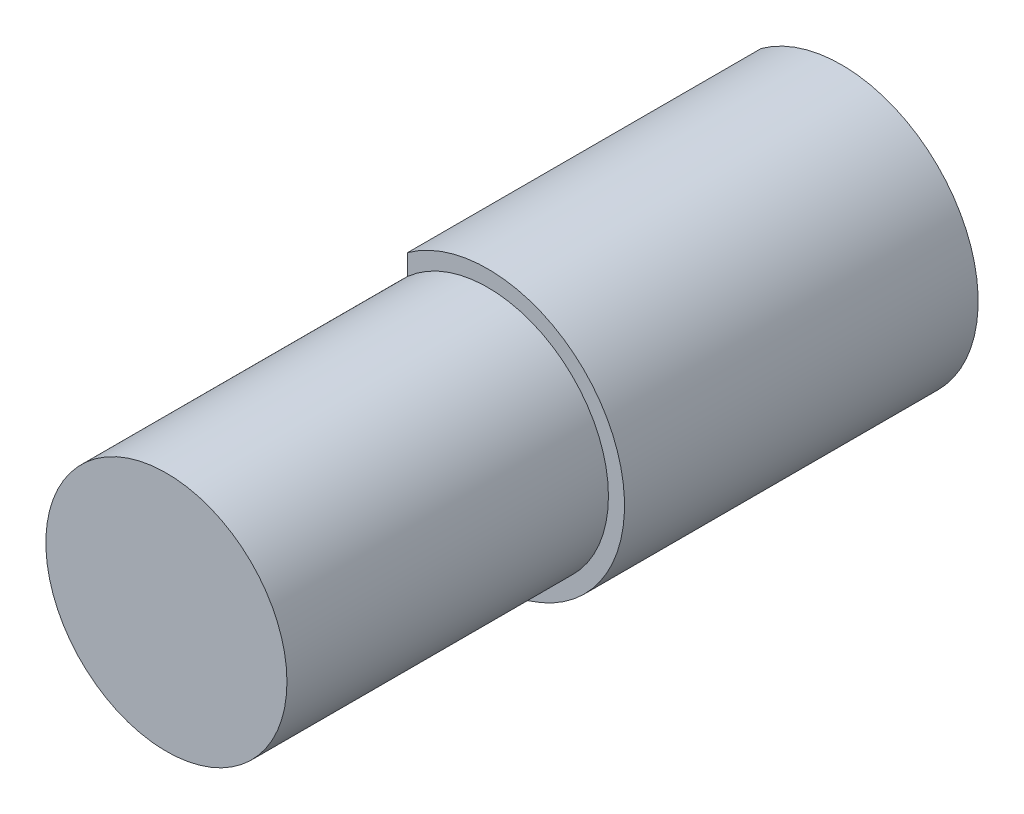
ISO-10303-21;
HEADER;
FILE_DESCRIPTION(('STEP AP214'),'2;1');
FILE_NAME('part.step','',(''),(''),'','','');
FILE_SCHEMA(('AUTOMOTIVE_DESIGN { 1 0 10303 214 1 1 1 1 }'));
ENDSEC;
DATA;
#1=APPLICATION_CONTEXT('core data for automotive mechanical design processes');
#2=APPLICATION_PROTOCOL_DEFINITION('international standard','automotive_design',2000,#1);
#3=PRODUCT_CONTEXT('',#1,'mechanical');
#4=PRODUCT('Part','Part','',(#3));
#5=PRODUCT_RELATED_PRODUCT_CATEGORY('part','',(#4));
#6=PRODUCT_DEFINITION_FORMATION('','',#4);
#7=PRODUCT_DEFINITION_CONTEXT('part definition',#1,'design');
#8=PRODUCT_DEFINITION('design','',#6,#7);
#9=PRODUCT_DEFINITION_SHAPE('','',#8);
#10=(LENGTH_UNIT() NAMED_UNIT(*) SI_UNIT(.MILLI.,.METRE.));
#11=(NAMED_UNIT(*) PLANE_ANGLE_UNIT() SI_UNIT($,.RADIAN.));
#12=(NAMED_UNIT(*) SI_UNIT($,.STERADIAN.) SOLID_ANGLE_UNIT());
#13=UNCERTAINTY_MEASURE_WITH_UNIT(LENGTH_MEASURE(1.E-05),#10,'distance_accuracy_value','');
#14=(GEOMETRIC_REPRESENTATION_CONTEXT(3) GLOBAL_UNCERTAINTY_ASSIGNED_CONTEXT((#13)) GLOBAL_UNIT_ASSIGNED_CONTEXT((#10,
#11,#12)) REPRESENTATION_CONTEXT('',''));
#15=CARTESIAN_POINT('',(0.,0.,0.));
#16=DIRECTION('',(0.,0.,1.));
#17=DIRECTION('',(1.,0.,0.));
#18=AXIS2_PLACEMENT_3D('',#15,#16,#17);
#19=CARTESIAN_POINT('',(0.,0.,-2.02081528017131));
#20=DIRECTION('',(0.,0.,1.));
#21=DIRECTION('',(1.,0.,0.));
#22=AXIS2_PLACEMENT_3D('',#19,#20,#21);
#23=CYLINDRICAL_SURFACE('',#22,3.75);
#24=CARTESIAN_POINT('',(0.,0.,10.));
#25=DIRECTION('',(0.,0.,1.));
#26=DIRECTION('',(1.,0.,0.));
#27=AXIS2_PLACEMENT_3D('',#24,#25,#26);
#28=CIRCLE('',#27,3.75);
#29=CARTESIAN_POINT('',(-2.5,-2.79508497187474,10.));
#30=VERTEX_POINT('',#29);
#31=CARTESIAN_POINT('',(-2.5,2.79508497187473,10.));
#32=VERTEX_POINT('',#31);
#33=EDGE_CURVE('E74',#30,#32,#28,.F.);
#34=ORIENTED_EDGE('',*,*,#33,.F.);
#35=EDGE_CURVE('E50',#32,#30,#28,.F.);
#36=ORIENTED_EDGE('',*,*,#35,.F.);
#37=EDGE_LOOP('',(#34,#36));
#38=FACE_BOUND('',#37,.T.);
#39=CARTESIAN_POINT('',(0.,0.,20.));
#40=DIRECTION('',(0.,0.,1.));
#41=DIRECTION('',(1.,0.,0.));
#42=AXIS2_PLACEMENT_3D('',#39,#40,#41);
#43=CIRCLE('',#42,3.75);
#44=CARTESIAN_POINT('',(3.75,0.,20.));
#45=VERTEX_POINT('',#44);
#46=EDGE_CURVE('E105',#45,#45,#43,.T.);
#47=ORIENTED_EDGE('',*,*,#46,.F.);
#48=EDGE_LOOP('',(#47));
#49=FACE_BOUND('',#48,.T.);
#50=ADVANCED_FACE('F33',(#38,#49),#23,.T.);
#51=CARTESIAN_POINT('',(0.,0.,10.));
#52=DIRECTION('',(0.,0.,-1.));
#53=DIRECTION('',(-1.,0.,0.));
#54=AXIS2_PLACEMENT_3D('',#51,#52,#53);
#55=CYLINDRICAL_SURFACE('',#54,4.25);
#56=CARTESIAN_POINT('',(0.,0.,10.));
#57=DIRECTION('',(0.,0.,1.));
#58=DIRECTION('',(1.,0.,0.));
#59=AXIS2_PLACEMENT_3D('',#56,#57,#58);
#60=CIRCLE('',#59,4.25);
#61=CARTESIAN_POINT('',(-2.5,3.43693177121688,10.));
#62=VERTEX_POINT('',#61);
#63=CARTESIAN_POINT('',(-2.5,-3.43693177121688,10.));
#64=VERTEX_POINT('',#63);
#65=EDGE_CURVE('E75',#62,#64,#60,.F.);
#66=ORIENTED_EDGE('',*,*,#65,.T.);
#67=DIRECTION('',(0.,0.,-1.));
#68=VECTOR('',#67,1.);
#69=CARTESIAN_POINT('',(-2.5,-3.43693177121688,10.));
#70=LINE('',#69,#68);
#71=CARTESIAN_POINT('',(-2.5,-3.43693177121688,-1.));
#72=VERTEX_POINT('',#71);
#73=EDGE_CURVE('E43',#64,#72,#70,.T.);
#74=ORIENTED_EDGE('',*,*,#73,.T.);
#75=CARTESIAN_POINT('',(0.,0.,-1.));
#76=DIRECTION('',(0.,0.,-1.));
#77=DIRECTION('',(-1.,0.,0.));
#78=AXIS2_PLACEMENT_3D('',#75,#76,#77);
#79=CIRCLE('',#78,4.25);
#80=CARTESIAN_POINT('',(-2.5,3.43693177121688,-1.));
#81=VERTEX_POINT('',#80);
#82=EDGE_CURVE('E81',#81,#72,#79,.T.);
#83=ORIENTED_EDGE('',*,*,#82,.F.);
#84=DIRECTION('',(0.,0.,-1.));
#85=VECTOR('',#84,1.);
#86=CARTESIAN_POINT('',(-2.5,3.43693177121688,10.));
#87=LINE('',#86,#85);
#88=EDGE_CURVE('E11',#62,#81,#87,.T.);
#89=ORIENTED_EDGE('',*,*,#88,.F.);
#90=EDGE_LOOP('',(#66,#74,#83,#89));
#91=FACE_BOUND('',#90,.T.);
#92=ADVANCED_FACE('F35',(#91),#55,.T.);
#93=CARTESIAN_POINT('',(0.,0.,10.));
#94=DIRECTION('',(0.,0.,1.));
#95=DIRECTION('',(1.,0.,0.));
#96=AXIS2_PLACEMENT_3D('',#93,#94,#95);
#97=PLANE('',#96);
#98=ORIENTED_EDGE('',*,*,#33,.T.);
#99=DIRECTION('',(0.,-1.,0.));
#100=VECTOR('',#99,1.);
#101=CARTESIAN_POINT('',(-2.5,3.43693177121688,10.));
#102=LINE('',#101,#100);
#103=EDGE_CURVE('E84',#32,#30,#102,.T.);
#104=ORIENTED_EDGE('',*,*,#103,.T.);
#105=EDGE_LOOP('',(#98,#104));
#106=FACE_BOUND('',#105,.T.);
#107=ADVANCED_FACE('F86',(#106),#97,.F.);
#108=CARTESIAN_POINT('',(-2.5,3.43693177121688,10.));
#109=DIRECTION('',(1.,0.,0.));
#110=DIRECTION('',(0.,0.,-1.));
#111=AXIS2_PLACEMENT_3D('',#108,#109,#110);
#112=PLANE('',#111);
#113=ORIENTED_EDGE('',*,*,#88,.T.);
#114=DIRECTION('',(0.,1.,0.));
#115=VECTOR('',#114,1.);
#116=CARTESIAN_POINT('',(-2.5,-3.43693177121688,-1.));
#117=LINE('',#116,#115);
#118=EDGE_CURVE('E85',#72,#81,#117,.T.);
#119=ORIENTED_EDGE('',*,*,#118,.F.);
#120=ORIENTED_EDGE('',*,*,#73,.F.);
#121=EDGE_CURVE('E37',#30,#64,#102,.T.);
#122=ORIENTED_EDGE('',*,*,#121,.F.);
#123=ORIENTED_EDGE('',*,*,#103,.F.);
#124=EDGE_CURVE('E72',#62,#32,#102,.T.);
#125=ORIENTED_EDGE('',*,*,#124,.F.);
#126=EDGE_LOOP('',(#113,#119,#120,#122,#123,#125));
#127=FACE_BOUND('',#126,.T.);
#128=ADVANCED_FACE('F83',(#127),#112,.F.);
#129=CARTESIAN_POINT('',(0.,0.,-1.));
#130=DIRECTION('',(0.,0.,-1.));
#131=DIRECTION('',(-1.,0.,0.));
#132=AXIS2_PLACEMENT_3D('',#129,#130,#131);
#133=PLANE('',#132);
#134=ORIENTED_EDGE('',*,*,#82,.T.);
#135=ORIENTED_EDGE('',*,*,#118,.T.);
#136=EDGE_LOOP('',(#134,#135));
#137=FACE_BOUND('',#136,.T.);
#138=ADVANCED_FACE('F102',(#137),#133,.T.);
#139=CARTESIAN_POINT('',(0.,0.,10.));
#140=DIRECTION('',(0.,0.,1.));
#141=DIRECTION('',(1.,0.,0.));
#142=AXIS2_PLACEMENT_3D('',#139,#140,#141);
#143=PLANE('',#142);
#144=ORIENTED_EDGE('',*,*,#124,.T.);
#145=ORIENTED_EDGE('',*,*,#35,.T.);
#146=ORIENTED_EDGE('',*,*,#121,.T.);
#147=ORIENTED_EDGE('',*,*,#65,.F.);
#148=EDGE_LOOP('',(#144,#145,#146,#147));
#149=FACE_BOUND('',#148,.T.);
#150=ADVANCED_FACE('F69',(#149),#143,.T.);
#151=CARTESIAN_POINT('',(0.,0.,20.));
#152=DIRECTION('',(0.,0.,1.));
#153=DIRECTION('',(1.,0.,0.));
#154=AXIS2_PLACEMENT_3D('',#151,#152,#153);
#155=PLANE('',#154);
#156=ORIENTED_EDGE('',*,*,#46,.T.);
#157=EDGE_LOOP('',(#156));
#158=FACE_BOUND('',#157,.T.);
#159=ADVANCED_FACE('F111',(#158),#155,.T.);
#160=CLOSED_SHELL('',(#50,#92,#107,#128,#138,#150,#159));
#161=MANIFOLD_SOLID_BREP('B2',#160);
#162=ADVANCED_BREP_SHAPE_REPRESENTATION('',(#18,#161),#14);
#163=SHAPE_DEFINITION_REPRESENTATION(#9,#162);
ENDSEC;
END-ISO-10303-21;
